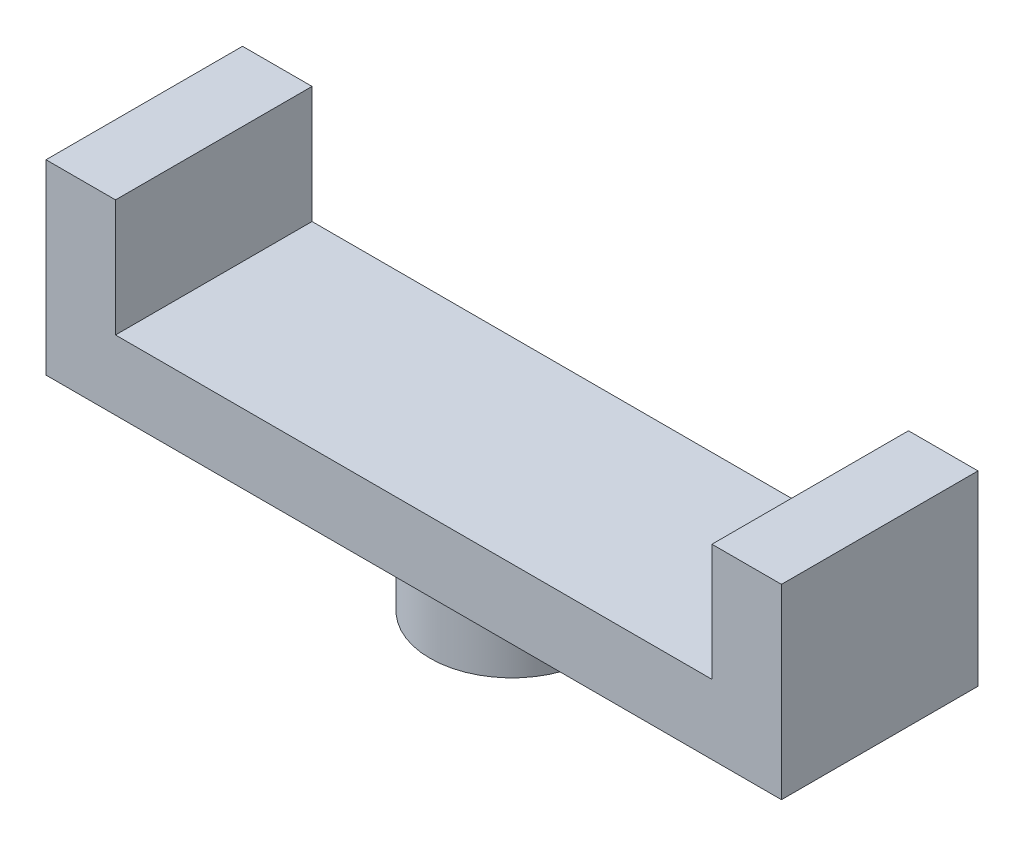
ISO-10303-21;
HEADER;
FILE_DESCRIPTION(('STEP AP214'),'2;1');
FILE_NAME('part.step','',(''),(''),'','','');
FILE_SCHEMA(('AUTOMOTIVE_DESIGN { 1 0 10303 214 1 1 1 1 }'));
ENDSEC;
DATA;
#1=APPLICATION_CONTEXT('core data for automotive mechanical design processes');
#2=APPLICATION_PROTOCOL_DEFINITION('international standard','automotive_design',2000,#1);
#3=PRODUCT_CONTEXT('',#1,'mechanical');
#4=PRODUCT('Part','Part','',(#3));
#5=PRODUCT_RELATED_PRODUCT_CATEGORY('part','',(#4));
#6=PRODUCT_DEFINITION_FORMATION('','',#4);
#7=PRODUCT_DEFINITION_CONTEXT('part definition',#1,'design');
#8=PRODUCT_DEFINITION('design','',#6,#7);
#9=PRODUCT_DEFINITION_SHAPE('','',#8);
#10=(LENGTH_UNIT() NAMED_UNIT(*) SI_UNIT(.MILLI.,.METRE.));
#11=(NAMED_UNIT(*) PLANE_ANGLE_UNIT() SI_UNIT($,.RADIAN.));
#12=(NAMED_UNIT(*) SI_UNIT($,.STERADIAN.) SOLID_ANGLE_UNIT());
#13=UNCERTAINTY_MEASURE_WITH_UNIT(LENGTH_MEASURE(1.E-05),#10,'distance_accuracy_value','');
#14=(GEOMETRIC_REPRESENTATION_CONTEXT(3) GLOBAL_UNCERTAINTY_ASSIGNED_CONTEXT((#13)) GLOBAL_UNIT_ASSIGNED_CONTEXT((#10,
#11,#12)) REPRESENTATION_CONTEXT('',''));
#15=CARTESIAN_POINT('',(0.,0.,0.));
#16=DIRECTION('',(0.,0.,1.));
#17=DIRECTION('',(1.,0.,0.));
#18=AXIS2_PLACEMENT_3D('',#15,#16,#17);
#19=CARTESIAN_POINT('',(0.,0.,0.));
#20=DIRECTION('',(0.,1.,0.));
#21=DIRECTION('',(0.,0.,1.));
#22=AXIS2_PLACEMENT_3D('',#19,#20,#21);
#23=PLANE('',#22);
#24=CARTESIAN_POINT('',(0.,0.,0.));
#25=DIRECTION('',(0.,1.,0.));
#26=DIRECTION('',(0.,0.,1.));
#27=AXIS2_PLACEMENT_3D('',#24,#25,#26);
#28=CIRCLE('',#27,5.9);
#29=CARTESIAN_POINT('',(0.,0.,5.9));
#30=VERTEX_POINT('',#29);
#31=EDGE_CURVE('E37',#30,#30,#28,.T.);
#32=ORIENTED_EDGE('',*,*,#31,.F.);
#33=EDGE_LOOP('',(#32));
#34=FACE_BOUND('',#33,.T.);
#35=CARTESIAN_POINT('',(0.,0.,0.));
#36=DIRECTION('',(0.,1.,0.));
#37=DIRECTION('',(0.,0.,1.));
#38=AXIS2_PLACEMENT_3D('',#35,#36,#37);
#39=CIRCLE('',#38,2.3);
#40=CARTESIAN_POINT('',(0.,0.,2.3));
#41=VERTEX_POINT('',#40);
#42=EDGE_CURVE('E169',#41,#41,#39,.T.);
#43=ORIENTED_EDGE('',*,*,#42,.T.);
#44=EDGE_LOOP('',(#43));
#45=FACE_BOUND('',#44,.T.);
#46=ADVANCED_FACE('F33',(#34,#45),#23,.F.);
#47=CARTESIAN_POINT('',(0.,5.,0.));
#48=DIRECTION('',(0.,-1.,0.));
#49=DIRECTION('',(0.,0.,-1.));
#50=AXIS2_PLACEMENT_3D('',#47,#48,#49);
#51=CYLINDRICAL_SURFACE('',#50,5.9);
#52=CARTESIAN_POINT('',(0.,5.,0.));
#53=DIRECTION('',(0.,1.,0.));
#54=DIRECTION('',(0.,0.,1.));
#55=AXIS2_PLACEMENT_3D('',#52,#53,#54);
#56=CIRCLE('',#55,5.9);
#57=CARTESIAN_POINT('',(0.,5.,5.9));
#58=VERTEX_POINT('',#57);
#59=EDGE_CURVE('E11',#58,#58,#56,.T.);
#60=ORIENTED_EDGE('',*,*,#59,.F.);
#61=EDGE_LOOP('',(#60));
#62=FACE_BOUND('',#61,.T.);
#63=ORIENTED_EDGE('',*,*,#31,.T.);
#64=EDGE_LOOP('',(#63));
#65=FACE_BOUND('',#64,.T.);
#66=ADVANCED_FACE('F35',(#62,#65),#51,.T.);
#67=CARTESIAN_POINT('',(0.,5.,0.));
#68=DIRECTION('',(0.,-1.,0.));
#69=DIRECTION('',(0.,0.,-1.));
#70=AXIS2_PLACEMENT_3D('',#67,#68,#69);
#71=CYLINDRICAL_SURFACE('',#70,2.3);
#72=CARTESIAN_POINT('',(0.,5.,0.));
#73=DIRECTION('',(0.,1.,0.));
#74=DIRECTION('',(0.,0.,1.));
#75=AXIS2_PLACEMENT_3D('',#72,#73,#74);
#76=CIRCLE('',#75,2.3);
#77=CARTESIAN_POINT('',(0.,5.,2.3));
#78=VERTEX_POINT('',#77);
#79=EDGE_CURVE('E164',#78,#78,#76,.T.);
#80=ORIENTED_EDGE('',*,*,#79,.T.);
#81=EDGE_LOOP('',(#80));
#82=FACE_BOUND('',#81,.T.);
#83=ORIENTED_EDGE('',*,*,#42,.F.);
#84=EDGE_LOOP('',(#83));
#85=FACE_BOUND('',#84,.T.);
#86=ADVANCED_FACE('F181',(#82,#85),#71,.F.);
#87=CARTESIAN_POINT('',(0.,5.,0.));
#88=DIRECTION('',(0.,-1.,0.));
#89=DIRECTION('',(0.,0.,-1.));
#90=AXIS2_PLACEMENT_3D('',#87,#88,#89);
#91=PLANE('',#90);
#92=ORIENTED_EDGE('',*,*,#79,.F.);
#93=EDGE_LOOP('',(#92));
#94=FACE_BOUND('',#93,.T.);
#95=ADVANCED_FACE('F186',(#94),#91,.T.);
#96=CARTESIAN_POINT('',(21.45,10.,-7.0679333203417));
#97=DIRECTION('',(0.,0.,1.));
#98=DIRECTION('',(1.,0.,0.));
#99=AXIS2_PLACEMENT_3D('',#96,#97,#98);
#100=PLANE('',#99);
#101=DIRECTION('',(-1.,0.,0.));
#102=VECTOR('',#101,1.);
#103=CARTESIAN_POINT('',(21.45,5.,-7.0679333203417));
#104=LINE('',#103,#102);
#105=CARTESIAN_POINT('',(26.45,5.,-7.06793332034169));
#106=VERTEX_POINT('',#105);
#107=CARTESIAN_POINT('',(-26.45,5.,-7.06793332034169));
#108=VERTEX_POINT('',#107);
#109=EDGE_CURVE('E155',#106,#108,#104,.T.);
#110=ORIENTED_EDGE('',*,*,#109,.T.);
#111=DIRECTION('',(0.,-1.,0.));
#112=VECTOR('',#111,1.);
#113=CARTESIAN_POINT('',(-26.45,5.,-7.06793332034169));
#114=LINE('',#113,#112);
#115=CARTESIAN_POINT('',(-26.45,18.4161624113086,-7.06793332034169));
#116=VERTEX_POINT('',#115);
#117=EDGE_CURVE('E133',#116,#108,#114,.T.);
#118=ORIENTED_EDGE('',*,*,#117,.F.);
#119=DIRECTION('',(1.,0.,0.));
#120=VECTOR('',#119,1.);
#121=CARTESIAN_POINT('',(-26.45,18.4161624113086,-7.06793332034169));
#122=LINE('',#121,#120);
#123=CARTESIAN_POINT('',(-21.45,18.4161624113086,-7.06793332034169));
#124=VERTEX_POINT('',#123);
#125=EDGE_CURVE('E144',#116,#124,#122,.T.);
#126=ORIENTED_EDGE('',*,*,#125,.T.);
#127=DIRECTION('',(0.,-1.,0.));
#128=VECTOR('',#127,1.);
#129=CARTESIAN_POINT('',(-21.45,5.,-7.06793332034169));
#130=LINE('',#129,#128);
#131=CARTESIAN_POINT('',(-21.45,10.,-7.06793332034169));
#132=VERTEX_POINT('',#131);
#133=EDGE_CURVE('E108',#124,#132,#130,.T.);
#134=ORIENTED_EDGE('',*,*,#133,.T.);
#135=DIRECTION('',(-1.,0.,0.));
#136=VECTOR('',#135,1.);
#137=CARTESIAN_POINT('',(21.45,10.,-7.0679333203417));
#138=LINE('',#137,#136);
#139=CARTESIAN_POINT('',(21.45,10.,-7.0679333203417));
#140=VERTEX_POINT('',#139);
#141=EDGE_CURVE('E156',#140,#132,#138,.T.);
#142=ORIENTED_EDGE('',*,*,#141,.F.);
#143=DIRECTION('',(0.,-1.,0.));
#144=VECTOR('',#143,1.);
#145=CARTESIAN_POINT('',(21.45,5.,-7.06793332034169));
#146=LINE('',#145,#144);
#147=CARTESIAN_POINT('',(21.45,18.4161624113086,-7.06793332034169));
#148=VERTEX_POINT('',#147);
#149=EDGE_CURVE('E48',#148,#140,#146,.T.);
#150=ORIENTED_EDGE('',*,*,#149,.F.);
#151=DIRECTION('',(-1.,0.,0.));
#152=VECTOR('',#151,1.);
#153=CARTESIAN_POINT('',(26.45,18.4161624113086,-7.06793332034169));
#154=LINE('',#153,#152);
#155=CARTESIAN_POINT('',(26.45,18.4161624113086,-7.06793332034169));
#156=VERTEX_POINT('',#155);
#157=EDGE_CURVE('E99',#156,#148,#154,.T.);
#158=ORIENTED_EDGE('',*,*,#157,.F.);
#159=DIRECTION('',(0.,-1.,0.));
#160=VECTOR('',#159,1.);
#161=CARTESIAN_POINT('',(26.45,5.,-7.06793332034169));
#162=LINE('',#161,#160);
#163=EDGE_CURVE('E102',#156,#106,#162,.T.);
#164=ORIENTED_EDGE('',*,*,#163,.T.);
#165=EDGE_LOOP('',(#110,#118,#126,#134,#142,#150,#158,#164));
#166=FACE_BOUND('',#165,.T.);
#167=ADVANCED_FACE('F101',(#166),#100,.F.);
#168=CARTESIAN_POINT('',(21.45,10.,7.06793332034169));
#169=DIRECTION('',(0.,0.,1.));
#170=DIRECTION('',(1.,0.,0.));
#171=AXIS2_PLACEMENT_3D('',#168,#169,#170);
#172=PLANE('',#171);
#173=DIRECTION('',(-1.,0.,0.));
#174=VECTOR('',#173,1.);
#175=CARTESIAN_POINT('',(21.45,5.,7.06793332034169));
#176=LINE('',#175,#174);
#177=CARTESIAN_POINT('',(26.45,5.,7.0679333203417));
#178=VERTEX_POINT('',#177);
#179=CARTESIAN_POINT('',(-26.45,5.,7.0679333203417));
#180=VERTEX_POINT('',#179);
#181=EDGE_CURVE('E158',#178,#180,#176,.T.);
#182=ORIENTED_EDGE('',*,*,#181,.F.);
#183=DIRECTION('',(0.,1.,0.));
#184=VECTOR('',#183,1.);
#185=CARTESIAN_POINT('',(26.45,5.,7.0679333203417));
#186=LINE('',#185,#184);
#187=CARTESIAN_POINT('',(26.45,18.4161624113086,7.0679333203417));
#188=VERTEX_POINT('',#187);
#189=EDGE_CURVE('E123',#178,#188,#186,.T.);
#190=ORIENTED_EDGE('',*,*,#189,.T.);
#191=DIRECTION('',(-1.,0.,0.));
#192=VECTOR('',#191,1.);
#193=CARTESIAN_POINT('',(26.45,18.4161624113086,7.0679333203417));
#194=LINE('',#193,#192);
#195=CARTESIAN_POINT('',(21.45,18.4161624113086,7.0679333203417));
#196=VERTEX_POINT('',#195);
#197=EDGE_CURVE('E109',#188,#196,#194,.T.);
#198=ORIENTED_EDGE('',*,*,#197,.T.);
#199=DIRECTION('',(0.,1.,0.));
#200=VECTOR('',#199,1.);
#201=CARTESIAN_POINT('',(21.45,5.,7.0679333203417));
#202=LINE('',#201,#200);
#203=CARTESIAN_POINT('',(21.45,10.,7.0679333203417));
#204=VERTEX_POINT('',#203);
#205=EDGE_CURVE('E119',#204,#196,#202,.T.);
#206=ORIENTED_EDGE('',*,*,#205,.F.);
#207=DIRECTION('',(-1.,0.,0.));
#208=VECTOR('',#207,1.);
#209=CARTESIAN_POINT('',(21.45,10.,7.06793332034169));
#210=LINE('',#209,#208);
#211=CARTESIAN_POINT('',(-21.45,10.,7.0679333203417));
#212=VERTEX_POINT('',#211);
#213=EDGE_CURVE('E160',#204,#212,#210,.T.);
#214=ORIENTED_EDGE('',*,*,#213,.T.);
#215=DIRECTION('',(0.,1.,0.));
#216=VECTOR('',#215,1.);
#217=CARTESIAN_POINT('',(-21.45,5.,7.0679333203417));
#218=LINE('',#217,#216);
#219=CARTESIAN_POINT('',(-21.45,18.4161624113086,7.0679333203417));
#220=VERTEX_POINT('',#219);
#221=EDGE_CURVE('E147',#212,#220,#218,.T.);
#222=ORIENTED_EDGE('',*,*,#221,.T.);
#223=DIRECTION('',(1.,0.,0.));
#224=VECTOR('',#223,1.);
#225=CARTESIAN_POINT('',(-26.45,18.4161624113086,7.0679333203417));
#226=LINE('',#225,#224);
#227=CARTESIAN_POINT('',(-26.45,18.4161624113086,7.0679333203417));
#228=VERTEX_POINT('',#227);
#229=EDGE_CURVE('E152',#228,#220,#226,.T.);
#230=ORIENTED_EDGE('',*,*,#229,.F.);
#231=DIRECTION('',(0.,1.,0.));
#232=VECTOR('',#231,1.);
#233=CARTESIAN_POINT('',(-26.45,5.,7.0679333203417));
#234=LINE('',#233,#232);
#235=EDGE_CURVE('E140',#180,#228,#234,.T.);
#236=ORIENTED_EDGE('',*,*,#235,.F.);
#237=EDGE_LOOP('',(#182,#190,#198,#206,#214,#222,#230,#236));
#238=FACE_BOUND('',#237,.T.);
#239=ADVANCED_FACE('F190',(#238),#172,.T.);
#240=CARTESIAN_POINT('',(0.,10.,0.));
#241=DIRECTION('',(0.,-1.,0.));
#242=DIRECTION('',(0.,0.,-1.));
#243=AXIS2_PLACEMENT_3D('',#240,#241,#242);
#244=PLANE('',#243);
#245=ORIENTED_EDGE('',*,*,#141,.T.);
#246=DIRECTION('',(0.,0.,-1.));
#247=VECTOR('',#246,1.);
#248=CARTESIAN_POINT('',(-21.45,10.,7.0679333203417));
#249=LINE('',#248,#247);
#250=EDGE_CURVE('E56',#212,#132,#249,.T.);
#251=ORIENTED_EDGE('',*,*,#250,.F.);
#252=ORIENTED_EDGE('',*,*,#213,.F.);
#253=DIRECTION('',(0.,0.,-1.));
#254=VECTOR('',#253,1.);
#255=CARTESIAN_POINT('',(21.45,10.,7.06793332034169));
#256=LINE('',#255,#254);
#257=EDGE_CURVE('E162',#204,#140,#256,.T.);
#258=ORIENTED_EDGE('',*,*,#257,.T.);
#259=EDGE_LOOP('',(#245,#251,#252,#258));
#260=FACE_BOUND('',#259,.T.);
#261=ADVANCED_FACE('F193',(#260),#244,.F.);
#262=ORIENTED_EDGE('',*,*,#59,.T.);
#263=EDGE_LOOP('',(#262));
#264=FACE_BOUND('',#263,.T.);
#265=ORIENTED_EDGE('',*,*,#109,.F.);
#266=DIRECTION('',(0.,0.,1.));
#267=VECTOR('',#266,1.);
#268=CARTESIAN_POINT('',(26.45,5.,-7.06793332034169));
#269=LINE('',#268,#267);
#270=EDGE_CURVE('E118',#106,#178,#269,.T.);
#271=ORIENTED_EDGE('',*,*,#270,.T.);
#272=ORIENTED_EDGE('',*,*,#181,.T.);
#273=DIRECTION('',(0.,0.,1.));
#274=VECTOR('',#273,1.);
#275=CARTESIAN_POINT('',(-26.45,5.,-7.06793332034169));
#276=LINE('',#275,#274);
#277=EDGE_CURVE('E136',#108,#180,#276,.T.);
#278=ORIENTED_EDGE('',*,*,#277,.F.);
#279=EDGE_LOOP('',(#265,#271,#272,#278));
#280=FACE_BOUND('',#279,.T.);
#281=ADVANCED_FACE('F195',(#264,#280),#91,.T.);
#282=CARTESIAN_POINT('',(-26.45,18.4161624113086,-7.06793332034169));
#283=DIRECTION('',(0.,-1.,0.));
#284=DIRECTION('',(0.,0.,-1.));
#285=AXIS2_PLACEMENT_3D('',#282,#283,#284);
#286=PLANE('',#285);
#287=DIRECTION('',(0.,0.,-1.));
#288=VECTOR('',#287,1.);
#289=CARTESIAN_POINT('',(-21.45,18.4161624113086,-7.06793332034169));
#290=LINE('',#289,#288);
#291=EDGE_CURVE('E137',#220,#124,#290,.T.);
#292=ORIENTED_EDGE('',*,*,#291,.T.);
#293=ORIENTED_EDGE('',*,*,#125,.F.);
#294=DIRECTION('',(0.,0.,-1.));
#295=VECTOR('',#294,1.);
#296=CARTESIAN_POINT('',(-26.45,18.4161624113086,-7.06793332034169));
#297=LINE('',#296,#295);
#298=EDGE_CURVE('E142',#228,#116,#297,.T.);
#299=ORIENTED_EDGE('',*,*,#298,.F.);
#300=ORIENTED_EDGE('',*,*,#229,.T.);
#301=EDGE_LOOP('',(#292,#293,#299,#300));
#302=FACE_BOUND('',#301,.T.);
#303=ADVANCED_FACE('F198',(#302),#286,.F.);
#304=CARTESIAN_POINT('',(-26.45,0.,0.));
#305=DIRECTION('',(1.,0.,0.));
#306=DIRECTION('',(0.,0.,-1.));
#307=AXIS2_PLACEMENT_3D('',#304,#305,#306);
#308=PLANE('',#307);
#309=ORIENTED_EDGE('',*,*,#117,.T.);
#310=ORIENTED_EDGE('',*,*,#277,.T.);
#311=ORIENTED_EDGE('',*,*,#235,.T.);
#312=ORIENTED_EDGE('',*,*,#298,.T.);
#313=EDGE_LOOP('',(#309,#310,#311,#312));
#314=FACE_BOUND('',#313,.T.);
#315=ADVANCED_FACE('F204',(#314),#308,.F.);
#316=CARTESIAN_POINT('',(-21.45,0.,0.));
#317=DIRECTION('',(1.,0.,0.));
#318=DIRECTION('',(0.,0.,-1.));
#319=AXIS2_PLACEMENT_3D('',#316,#317,#318);
#320=PLANE('',#319);
#321=ORIENTED_EDGE('',*,*,#221,.F.);
#322=ORIENTED_EDGE('',*,*,#250,.T.);
#323=ORIENTED_EDGE('',*,*,#133,.F.);
#324=ORIENTED_EDGE('',*,*,#291,.F.);
#325=EDGE_LOOP('',(#321,#322,#323,#324));
#326=FACE_BOUND('',#325,.T.);
#327=ADVANCED_FACE('F206',(#326),#320,.T.);
#328=CARTESIAN_POINT('',(21.45,0.,0.));
#329=DIRECTION('',(-1.,0.,0.));
#330=DIRECTION('',(0.,0.,-1.));
#331=AXIS2_PLACEMENT_3D('',#328,#329,#330);
#332=PLANE('',#331);
#333=ORIENTED_EDGE('',*,*,#257,.F.);
#334=ORIENTED_EDGE('',*,*,#205,.T.);
#335=DIRECTION('',(0.,0.,-1.));
#336=VECTOR('',#335,1.);
#337=CARTESIAN_POINT('',(21.45,18.4161624113086,-7.06793332034169));
#338=LINE('',#337,#336);
#339=EDGE_CURVE('E129',#196,#148,#338,.T.);
#340=ORIENTED_EDGE('',*,*,#339,.T.);
#341=ORIENTED_EDGE('',*,*,#149,.T.);
#342=EDGE_LOOP('',(#333,#334,#340,#341));
#343=FACE_BOUND('',#342,.T.);
#344=ADVANCED_FACE('F209',(#343),#332,.T.);
#345=CARTESIAN_POINT('',(26.45,18.4161624113086,-7.06793332034169));
#346=DIRECTION('',(0.,1.,0.));
#347=DIRECTION('',(0.,0.,1.));
#348=AXIS2_PLACEMENT_3D('',#345,#346,#347);
#349=PLANE('',#348);
#350=ORIENTED_EDGE('',*,*,#339,.F.);
#351=ORIENTED_EDGE('',*,*,#197,.F.);
#352=DIRECTION('',(0.,0.,-1.));
#353=VECTOR('',#352,1.);
#354=CARTESIAN_POINT('',(26.45,18.4161624113086,-7.06793332034169));
#355=LINE('',#354,#353);
#356=EDGE_CURVE('E115',#188,#156,#355,.T.);
#357=ORIENTED_EDGE('',*,*,#356,.T.);
#358=ORIENTED_EDGE('',*,*,#157,.T.);
#359=EDGE_LOOP('',(#350,#351,#357,#358));
#360=FACE_BOUND('',#359,.T.);
#361=ADVANCED_FACE('F121',(#360),#349,.T.);
#362=CARTESIAN_POINT('',(26.45,0.,0.));
#363=DIRECTION('',(-1.,0.,0.));
#364=DIRECTION('',(0.,0.,-1.));
#365=AXIS2_PLACEMENT_3D('',#362,#363,#364);
#366=PLANE('',#365);
#367=ORIENTED_EDGE('',*,*,#163,.F.);
#368=ORIENTED_EDGE('',*,*,#356,.F.);
#369=ORIENTED_EDGE('',*,*,#189,.F.);
#370=ORIENTED_EDGE('',*,*,#270,.F.);
#371=EDGE_LOOP('',(#367,#368,#369,#370));
#372=FACE_BOUND('',#371,.T.);
#373=ADVANCED_FACE('F113',(#372),#366,.F.);
#374=CLOSED_SHELL('',(#46,#66,#86,#95,#167,#239,#261,#281,#303,#315,#327,#344,#361,#373));
#375=MANIFOLD_SOLID_BREP('B2',#374);
#376=ADVANCED_BREP_SHAPE_REPRESENTATION('',(#18,#375),#14);
#377=SHAPE_DEFINITION_REPRESENTATION(#9,#376);
ENDSEC;
END-ISO-10303-21;
